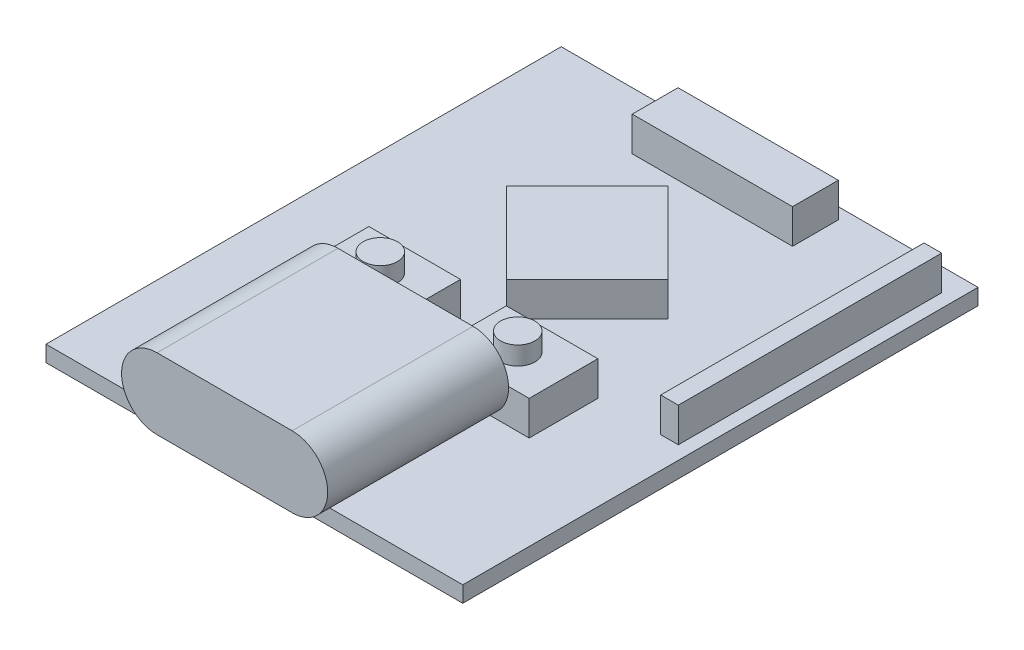
ISO-10303-21;
HEADER;
FILE_DESCRIPTION(('STEP AP214'),'2;1');
FILE_NAME('part.step','',(''),(''),'','','');
FILE_SCHEMA(('AUTOMOTIVE_DESIGN { 1 0 10303 214 1 1 1 1 }'));
ENDSEC;
DATA;
#1=APPLICATION_CONTEXT('core data for automotive mechanical design processes');
#2=APPLICATION_PROTOCOL_DEFINITION('international standard','automotive_design',2000,#1);
#3=PRODUCT_CONTEXT('',#1,'mechanical');
#4=PRODUCT('Part','Part','',(#3));
#5=PRODUCT_RELATED_PRODUCT_CATEGORY('part','',(#4));
#6=PRODUCT_DEFINITION_FORMATION('','',#4);
#7=PRODUCT_DEFINITION_CONTEXT('part definition',#1,'design');
#8=PRODUCT_DEFINITION('design','',#6,#7);
#9=PRODUCT_DEFINITION_SHAPE('','',#8);
#10=(LENGTH_UNIT() NAMED_UNIT(*) SI_UNIT(.MILLI.,.METRE.));
#11=(NAMED_UNIT(*) PLANE_ANGLE_UNIT() SI_UNIT($,.RADIAN.));
#12=(NAMED_UNIT(*) SI_UNIT($,.STERADIAN.) SOLID_ANGLE_UNIT());
#13=UNCERTAINTY_MEASURE_WITH_UNIT(LENGTH_MEASURE(1.E-05),#10,'distance_accuracy_value','');
#14=(GEOMETRIC_REPRESENTATION_CONTEXT(3) GLOBAL_UNCERTAINTY_ASSIGNED_CONTEXT((#13)) GLOBAL_UNIT_ASSIGNED_CONTEXT((#10,
#11,#12)) REPRESENTATION_CONTEXT('',''));
#15=CARTESIAN_POINT('',(0.,0.,0.));
#16=DIRECTION('',(0.,0.,1.));
#17=DIRECTION('',(1.,0.,0.));
#18=AXIS2_PLACEMENT_3D('',#15,#16,#17);
#19=CARTESIAN_POINT('',(-2.95,2.55,-6.6));
#20=DIRECTION('',(0.,0.,1.));
#21=DIRECTION('',(1.,0.,0.));
#22=AXIS2_PLACEMENT_3D('',#19,#20,#21);
#23=CYLINDRICAL_SURFACE('',#22,1.55);
#24=CARTESIAN_POINT('',(-2.95,2.55,1.3));
#25=DIRECTION('',(0.,0.,1.));
#26=DIRECTION('',(1.,0.,0.));
#27=AXIS2_PLACEMENT_3D('',#24,#25,#26);
#28=CIRCLE('',#27,1.55);
#29=CARTESIAN_POINT('',(-2.95,4.1,1.3));
#30=VERTEX_POINT('',#29);
#31=CARTESIAN_POINT('',(-2.95,1.,1.3));
#32=VERTEX_POINT('',#31);
#33=EDGE_CURVE('E123',#30,#32,#28,.T.);
#34=ORIENTED_EDGE('',*,*,#33,.F.);
#35=DIRECTION('',(0.,0.,1.));
#36=VECTOR('',#35,1.);
#37=CARTESIAN_POINT('',(-2.95,4.1,-6.6));
#38=LINE('',#37,#36);
#39=CARTESIAN_POINT('',(-2.95,4.1,-6.6));
#40=VERTEX_POINT('',#39);
#41=EDGE_CURVE('E14',#40,#30,#38,.T.);
#42=ORIENTED_EDGE('',*,*,#41,.F.);
#43=CARTESIAN_POINT('',(-2.95,2.55,-6.6));
#44=DIRECTION('',(0.,0.,1.));
#45=DIRECTION('',(1.,0.,0.));
#46=AXIS2_PLACEMENT_3D('',#43,#44,#45);
#47=CIRCLE('',#46,1.55);
#48=CARTESIAN_POINT('',(-2.95,1.,-6.6));
#49=VERTEX_POINT('',#48);
#50=EDGE_CURVE('E117',#40,#49,#47,.T.);
#51=ORIENTED_EDGE('',*,*,#50,.T.);
#52=DIRECTION('',(0.,0.,1.));
#53=VECTOR('',#52,1.);
#54=CARTESIAN_POINT('',(-2.95,1.,-6.6));
#55=LINE('',#54,#53);
#56=EDGE_CURVE('E62',#49,#32,#55,.T.);
#57=ORIENTED_EDGE('',*,*,#56,.T.);
#58=EDGE_LOOP('',(#34,#42,#51,#57));
#59=FACE_BOUND('',#58,.T.);
#60=ADVANCED_FACE('F59',(#59),#23,.T.);
#61=CARTESIAN_POINT('',(-2.95,4.1,-6.6));
#62=DIRECTION('',(0.,1.,0.));
#63=DIRECTION('',(-1.,0.,0.));
#64=AXIS2_PLACEMENT_3D('',#61,#62,#63);
#65=PLANE('',#64);
#66=DIRECTION('',(-1.,0.,0.));
#67=VECTOR('',#66,1.);
#68=CARTESIAN_POINT('',(-2.95,4.1,1.3));
#69=LINE('',#68,#67);
#70=CARTESIAN_POINT('',(2.95,4.1,1.3));
#71=VERTEX_POINT('',#70);
#72=EDGE_CURVE('E119',#71,#30,#69,.T.);
#73=ORIENTED_EDGE('',*,*,#72,.F.);
#74=DIRECTION('',(0.,0.,1.));
#75=VECTOR('',#74,1.);
#76=CARTESIAN_POINT('',(2.95,4.1,-6.6));
#77=LINE('',#76,#75);
#78=CARTESIAN_POINT('',(2.95,4.1,-6.6));
#79=VERTEX_POINT('',#78);
#80=EDGE_CURVE('E68',#79,#71,#77,.T.);
#81=ORIENTED_EDGE('',*,*,#80,.F.);
#82=DIRECTION('',(-1.,0.,0.));
#83=VECTOR('',#82,1.);
#84=CARTESIAN_POINT('',(-2.95,4.1,-6.6));
#85=LINE('',#84,#83);
#86=EDGE_CURVE('E114',#79,#40,#85,.T.);
#87=ORIENTED_EDGE('',*,*,#86,.T.);
#88=ORIENTED_EDGE('',*,*,#41,.T.);
#89=EDGE_LOOP('',(#73,#81,#87,#88));
#90=FACE_BOUND('',#89,.T.);
#91=ADVANCED_FACE('F133',(#90),#65,.T.);
#92=CARTESIAN_POINT('',(2.95,2.55,-6.6));
#93=DIRECTION('',(0.,0.,1.));
#94=DIRECTION('',(1.,0.,0.));
#95=AXIS2_PLACEMENT_3D('',#92,#93,#94);
#96=CYLINDRICAL_SURFACE('',#95,1.55);
#97=CARTESIAN_POINT('',(2.95,2.55,1.3));
#98=DIRECTION('',(0.,0.,1.));
#99=DIRECTION('',(1.,0.,0.));
#100=AXIS2_PLACEMENT_3D('',#97,#98,#99);
#101=CIRCLE('',#100,1.55);
#102=CARTESIAN_POINT('',(2.95,1.,1.3));
#103=VERTEX_POINT('',#102);
#104=EDGE_CURVE('E109',#103,#71,#101,.T.);
#105=ORIENTED_EDGE('',*,*,#104,.F.);
#106=DIRECTION('',(0.,0.,1.));
#107=VECTOR('',#106,1.);
#108=CARTESIAN_POINT('',(2.95,1.,-6.6));
#109=LINE('',#108,#107);
#110=CARTESIAN_POINT('',(2.95,1.,-6.6));
#111=VERTEX_POINT('',#110);
#112=EDGE_CURVE('E104',#111,#103,#109,.T.);
#113=ORIENTED_EDGE('',*,*,#112,.F.);
#114=CARTESIAN_POINT('',(2.95,2.55,-6.6));
#115=DIRECTION('',(0.,0.,1.));
#116=DIRECTION('',(1.,0.,0.));
#117=AXIS2_PLACEMENT_3D('',#114,#115,#116);
#118=CIRCLE('',#117,1.55);
#119=EDGE_CURVE('E107',#111,#79,#118,.T.);
#120=ORIENTED_EDGE('',*,*,#119,.T.);
#121=ORIENTED_EDGE('',*,*,#80,.T.);
#122=EDGE_LOOP('',(#105,#113,#120,#121));
#123=FACE_BOUND('',#122,.T.);
#124=ADVANCED_FACE('F106',(#123),#96,.T.);
#125=CARTESIAN_POINT('',(-2.95,1.,-6.6));
#126=DIRECTION('',(0.,-1.,0.));
#127=DIRECTION('',(1.,0.,0.));
#128=AXIS2_PLACEMENT_3D('',#125,#126,#127);
#129=PLANE('',#128);
#130=DIRECTION('',(1.,0.,0.));
#131=VECTOR('',#130,1.);
#132=CARTESIAN_POINT('',(-2.95,1.,1.3));
#133=LINE('',#132,#131);
#134=EDGE_CURVE('E126',#32,#103,#133,.T.);
#135=ORIENTED_EDGE('',*,*,#134,.F.);
#136=ORIENTED_EDGE('',*,*,#56,.F.);
#137=DIRECTION('',(1.,0.,0.));
#138=VECTOR('',#137,1.);
#139=CARTESIAN_POINT('',(-2.95,1.,-6.6));
#140=LINE('',#139,#138);
#141=EDGE_CURVE('E113',#49,#111,#140,.T.);
#142=ORIENTED_EDGE('',*,*,#141,.T.);
#143=ORIENTED_EDGE('',*,*,#112,.T.);
#144=EDGE_LOOP('',(#135,#136,#142,#143));
#145=FACE_BOUND('',#144,.T.);
#146=ADVANCED_FACE('F116',(#145),#129,.T.);
#147=CARTESIAN_POINT('',(-2.95,2.55,-6.6));
#148=DIRECTION('',(0.,0.,1.));
#149=DIRECTION('',(1.,0.,0.));
#150=AXIS2_PLACEMENT_3D('',#147,#148,#149);
#151=PLANE('',#150);
#152=ORIENTED_EDGE('',*,*,#50,.F.);
#153=ORIENTED_EDGE('',*,*,#86,.F.);
#154=ORIENTED_EDGE('',*,*,#119,.F.);
#155=ORIENTED_EDGE('',*,*,#141,.F.);
#156=EDGE_LOOP('',(#152,#153,#154,#155));
#157=FACE_BOUND('',#156,.T.);
#158=ADVANCED_FACE('F112',(#157),#151,.F.);
#159=CARTESIAN_POINT('',(-2.95,2.55,1.3));
#160=DIRECTION('',(0.,0.,1.));
#161=DIRECTION('',(1.,0.,0.));
#162=AXIS2_PLACEMENT_3D('',#159,#160,#161);
#163=PLANE('',#162);
#164=ORIENTED_EDGE('',*,*,#33,.T.);
#165=ORIENTED_EDGE('',*,*,#134,.T.);
#166=ORIENTED_EDGE('',*,*,#104,.T.);
#167=ORIENTED_EDGE('',*,*,#72,.T.);
#168=EDGE_LOOP('',(#164,#165,#166,#167));
#169=FACE_BOUND('',#168,.T.);
#170=ADVANCED_FACE('F132',(#169),#163,.T.);
#171=CLOSED_SHELL('',(#60,#91,#124,#146,#158,#170));
#172=MANIFOLD_SOLID_BREP('B2',#171);
#173=CARTESIAN_POINT('',(0.,0.7,0.));
#174=DIRECTION('',(0.,-1.,0.));
#175=DIRECTION('',(0.,0.,-1.));
#176=AXIS2_PLACEMENT_3D('',#173,#174,#175);
#177=PLANE('',#176);
#178=DIRECTION('',(-1.,0.,0.));
#179=VECTOR('',#178,1.);
#180=CARTESIAN_POINT('',(0.,0.7,-10.));
#181=LINE('',#180,#179);
#182=CARTESIAN_POINT('',(-0.999999999999998,0.7,-10.));
#183=VERTEX_POINT('',#182);
#184=CARTESIAN_POINT('',(-5.,0.7,-10.));
#185=VERTEX_POINT('',#184);
#186=EDGE_CURVE('E413',#183,#185,#181,.T.);
#187=ORIENTED_EDGE('',*,*,#186,.F.);
#188=DIRECTION('',(0.,0.,-1.));
#189=VECTOR('',#188,1.);
#190=CARTESIAN_POINT('',(-0.999999999999996,0.7,0.));
#191=LINE('',#190,#189);
#192=CARTESIAN_POINT('',(-0.999999999999997,0.7,-7.));
#193=VERTEX_POINT('',#192);
#194=EDGE_CURVE('E404',#193,#183,#191,.T.);
#195=ORIENTED_EDGE('',*,*,#194,.F.);
#196=DIRECTION('',(1.,0.,0.));
#197=VECTOR('',#196,1.);
#198=CARTESIAN_POINT('',(0.,0.7,-7.));
#199=LINE('',#198,#197);
#200=CARTESIAN_POINT('',(-5.,0.7,-7.));
#201=VERTEX_POINT('',#200);
#202=EDGE_CURVE('E407',#201,#193,#199,.T.);
#203=ORIENTED_EDGE('',*,*,#202,.F.);
#204=DIRECTION('',(0.,0.,1.));
#205=VECTOR('',#204,1.);
#206=CARTESIAN_POINT('',(-5.,0.7,0.));
#207=LINE('',#206,#205);
#208=EDGE_CURVE('E410',#185,#201,#207,.T.);
#209=ORIENTED_EDGE('',*,*,#208,.F.);
#210=EDGE_LOOP('',(#187,#195,#203,#209));
#211=FACE_BOUND('',#210,.T.);
#212=DIRECTION('',(0.,0.,1.));
#213=VECTOR('',#212,1.);
#214=CARTESIAN_POINT('',(1.,0.7,0.));
#215=LINE('',#214,#213);
#216=CARTESIAN_POINT('',(1.,0.7,-10.));
#217=VERTEX_POINT('',#216);
#218=CARTESIAN_POINT('',(1.,0.7,-7.));
#219=VERTEX_POINT('',#218);
#220=EDGE_CURVE('E479',#217,#219,#215,.T.);
#221=ORIENTED_EDGE('',*,*,#220,.F.);
#222=DIRECTION('',(-1.,0.,0.));
#223=VECTOR('',#222,1.);
#224=CARTESIAN_POINT('',(0.,0.7,-10.));
#225=LINE('',#224,#223);
#226=CARTESIAN_POINT('',(5.,0.7,-10.));
#227=VERTEX_POINT('',#226);
#228=EDGE_CURVE('E470',#227,#217,#225,.T.);
#229=ORIENTED_EDGE('',*,*,#228,.F.);
#230=DIRECTION('',(0.,0.,-1.));
#231=VECTOR('',#230,1.);
#232=CARTESIAN_POINT('',(5.,0.7,0.));
#233=LINE('',#232,#231);
#234=CARTESIAN_POINT('',(5.,0.7,-7.));
#235=VERTEX_POINT('',#234);
#236=EDGE_CURVE('E473',#235,#227,#233,.T.);
#237=ORIENTED_EDGE('',*,*,#236,.F.);
#238=DIRECTION('',(1.,0.,0.));
#239=VECTOR('',#238,1.);
#240=CARTESIAN_POINT('',(0.,0.7,-7.));
#241=LINE('',#240,#239);
#242=EDGE_CURVE('E476',#219,#235,#241,.T.);
#243=ORIENTED_EDGE('',*,*,#242,.F.);
#244=EDGE_LOOP('',(#221,#229,#237,#243));
#245=FACE_BOUND('',#244,.T.);
#246=DIRECTION('',(0.,0.,1.));
#247=VECTOR('',#246,1.);
#248=CARTESIAN_POINT('',(-9.1,0.7,0.));
#249=LINE('',#248,#247);
#250=CARTESIAN_POINT('',(-9.1,0.7,-22.5));
#251=VERTEX_POINT('',#250);
#252=CARTESIAN_POINT('',(-9.1,0.7,0.));
#253=VERTEX_POINT('',#252);
#254=EDGE_CURVE('E516',#251,#253,#249,.T.);
#255=ORIENTED_EDGE('',*,*,#254,.T.);
#256=DIRECTION('',(1.,0.,0.));
#257=VECTOR('',#256,1.);
#258=CARTESIAN_POINT('',(-9.1,0.7,0.));
#259=LINE('',#258,#257);
#260=CARTESIAN_POINT('',(9.1,0.7,0.));
#261=VERTEX_POINT('',#260);
#262=EDGE_CURVE('E519',#253,#261,#259,.T.);
#263=ORIENTED_EDGE('',*,*,#262,.T.);
#264=DIRECTION('',(0.,0.,-1.));
#265=VECTOR('',#264,1.);
#266=CARTESIAN_POINT('',(9.1,0.7,0.));
#267=LINE('',#266,#265);
#268=CARTESIAN_POINT('',(9.1,0.7,-22.5));
#269=VERTEX_POINT('',#268);
#270=EDGE_CURVE('E522',#261,#269,#267,.T.);
#271=ORIENTED_EDGE('',*,*,#270,.T.);
#272=DIRECTION('',(-1.,0.,0.));
#273=VECTOR('',#272,1.);
#274=CARTESIAN_POINT('',(-9.1,0.7,-22.5));
#275=LINE('',#274,#273);
#276=EDGE_CURVE('E524',#269,#251,#275,.T.);
#277=ORIENTED_EDGE('',*,*,#276,.T.);
#278=EDGE_LOOP('',(#255,#263,#271,#277));
#279=FACE_BOUND('',#278,.T.);
#280=DIRECTION('',(0.707106781186548,0.,0.707106781186547));
#281=VECTOR('',#280,1.);
#282=CARTESIAN_POINT('',(5.5,0.7,-5.50000000000001));
#283=LINE('',#282,#281);
#284=CARTESIAN_POINT('',(-3.53553390593274,0.7,-14.5355339059327));
#285=VERTEX_POINT('',#284);
#286=CARTESIAN_POINT('',(0.,0.7,-11.));
#287=VERTEX_POINT('',#286);
#288=EDGE_CURVE('E512',#285,#287,#283,.T.);
#289=ORIENTED_EDGE('',*,*,#288,.F.);
#290=DIRECTION('',(-0.707106781186548,0.,0.707106781186547));
#291=VECTOR('',#290,1.);
#292=CARTESIAN_POINT('',(-9.03553390593274,0.7,-9.03553390593274));
#293=LINE('',#292,#291);
#294=CARTESIAN_POINT('',(0.,0.7,-18.0710678118655));
#295=VERTEX_POINT('',#294);
#296=EDGE_CURVE('E503',#295,#285,#293,.T.);
#297=ORIENTED_EDGE('',*,*,#296,.F.);
#298=DIRECTION('',(-0.707106781186548,0.,-0.707106781186547));
#299=VECTOR('',#298,1.);
#300=CARTESIAN_POINT('',(9.03553390593274,0.7,-9.03553390593274));
#301=LINE('',#300,#299);
#302=CARTESIAN_POINT('',(3.53553390593274,0.7,-14.5355339059327));
#303=VERTEX_POINT('',#302);
#304=EDGE_CURVE('E506',#303,#295,#301,.T.);
#305=ORIENTED_EDGE('',*,*,#304,.F.);
#306=DIRECTION('',(0.707106781186547,0.,-0.707106781186548));
#307=VECTOR('',#306,1.);
#308=CARTESIAN_POINT('',(-5.5,0.7,-5.5));
#309=LINE('',#308,#307);
#310=EDGE_CURVE('E509',#287,#303,#309,.T.);
#311=ORIENTED_EDGE('',*,*,#310,.F.);
#312=EDGE_LOOP('',(#289,#297,#305,#311));
#313=FACE_BOUND('',#312,.T.);
#314=DIRECTION('',(0.,0.,1.));
#315=VECTOR('',#314,1.);
#316=CARTESIAN_POINT('',(-3.5,0.7,0.));
#317=LINE('',#316,#315);
#318=CARTESIAN_POINT('',(-3.5,0.7,-22.));
#319=VERTEX_POINT('',#318);
#320=CARTESIAN_POINT('',(-3.5,0.7,-20.));
#321=VERTEX_POINT('',#320);
#322=EDGE_CURVE('E446',#319,#321,#317,.T.);
#323=ORIENTED_EDGE('',*,*,#322,.F.);
#324=DIRECTION('',(-1.,0.,0.));
#325=VECTOR('',#324,1.);
#326=CARTESIAN_POINT('',(0.,0.7,-22.));
#327=LINE('',#326,#325);
#328=CARTESIAN_POINT('',(3.5,0.7,-22.));
#329=VERTEX_POINT('',#328);
#330=EDGE_CURVE('E437',#329,#319,#327,.T.);
#331=ORIENTED_EDGE('',*,*,#330,.F.);
#332=DIRECTION('',(0.,0.,-1.));
#333=VECTOR('',#332,1.);
#334=CARTESIAN_POINT('',(3.49999999999999,0.7,0.));
#335=LINE('',#334,#333);
#336=CARTESIAN_POINT('',(3.5,0.7,-20.));
#337=VERTEX_POINT('',#336);
#338=EDGE_CURVE('E440',#337,#329,#335,.T.);
#339=ORIENTED_EDGE('',*,*,#338,.F.);
#340=DIRECTION('',(1.,0.,0.));
#341=VECTOR('',#340,1.);
#342=CARTESIAN_POINT('',(0.,0.7,-20.));
#343=LINE('',#342,#341);
#344=EDGE_CURVE('E443',#321,#337,#343,.T.);
#345=ORIENTED_EDGE('',*,*,#344,.F.);
#346=EDGE_LOOP('',(#323,#331,#339,#345));
#347=FACE_BOUND('',#346,.T.);
#348=DIRECTION('',(0.,0.,1.));
#349=VECTOR('',#348,1.);
#350=CARTESIAN_POINT('',(7.7437978616926,0.7,0.));
#351=LINE('',#350,#349);
#352=CARTESIAN_POINT('',(7.7437978616926,0.7,-21.5));
#353=VERTEX_POINT('',#352);
#354=CARTESIAN_POINT('',(7.7437978616926,0.7,-10.));
#355=VERTEX_POINT('',#354);
#356=EDGE_CURVE('E371',#353,#355,#351,.T.);
#357=ORIENTED_EDGE('',*,*,#356,.F.);
#358=DIRECTION('',(-1.,0.,0.));
#359=VECTOR('',#358,1.);
#360=CARTESIAN_POINT('',(0.,0.7,-21.5));
#361=LINE('',#360,#359);
#362=CARTESIAN_POINT('',(8.51186104562512,0.7,-21.5));
#363=VERTEX_POINT('',#362);
#364=EDGE_CURVE('E372',#363,#353,#361,.T.);
#365=ORIENTED_EDGE('',*,*,#364,.F.);
#366=DIRECTION('',(0.,0.,-1.));
#367=VECTOR('',#366,1.);
#368=CARTESIAN_POINT('',(8.51186104562511,0.7,0.));
#369=LINE('',#368,#367);
#370=CARTESIAN_POINT('',(8.51186104562511,0.7,-10.));
#371=VERTEX_POINT('',#370);
#372=EDGE_CURVE('E210',#371,#363,#369,.T.);
#373=ORIENTED_EDGE('',*,*,#372,.F.);
#374=DIRECTION('',(1.,0.,0.));
#375=VECTOR('',#374,1.);
#376=CARTESIAN_POINT('',(0.,0.7,-10.));
#377=LINE('',#376,#375);
#378=EDGE_CURVE('E205',#355,#371,#377,.T.);
#379=ORIENTED_EDGE('',*,*,#378,.F.);
#380=EDGE_LOOP('',(#357,#365,#373,#379));
#381=FACE_BOUND('',#380,.T.);
#382=ADVANCED_FACE('F188',(#211,#245,#279,#313,#347,#381),#177,.F.);
#383=CARTESIAN_POINT('',(-9.1,0.7,0.));
#384=DIRECTION('',(1.,0.,0.));
#385=DIRECTION('',(0.,0.,-1.));
#386=AXIS2_PLACEMENT_3D('',#383,#384,#385);
#387=PLANE('',#386);
#388=DIRECTION('',(0.,0.,1.));
#389=VECTOR('',#388,1.);
#390=CARTESIAN_POINT('',(-9.1,0.,0.));
#391=LINE('',#390,#389);
#392=CARTESIAN_POINT('',(-9.1,0.,-22.5));
#393=VERTEX_POINT('',#392);
#394=CARTESIAN_POINT('',(-9.1,0.,0.));
#395=VERTEX_POINT('',#394);
#396=EDGE_CURVE('E515',#393,#395,#391,.T.);
#397=ORIENTED_EDGE('',*,*,#396,.T.);
#398=DIRECTION('',(0.,-1.,0.));
#399=VECTOR('',#398,1.);
#400=CARTESIAN_POINT('',(-9.1,0.7,0.));
#401=LINE('',#400,#399);
#402=EDGE_CURVE('E57',#253,#395,#401,.T.);
#403=ORIENTED_EDGE('',*,*,#402,.F.);
#404=ORIENTED_EDGE('',*,*,#254,.F.);
#405=DIRECTION('',(0.,-1.,0.));
#406=VECTOR('',#405,1.);
#407=CARTESIAN_POINT('',(-9.1,0.7,-22.5));
#408=LINE('',#407,#406);
#409=EDGE_CURVE('E526',#251,#393,#408,.T.);
#410=ORIENTED_EDGE('',*,*,#409,.T.);
#411=EDGE_LOOP('',(#397,#403,#404,#410));
#412=FACE_BOUND('',#411,.T.);
#413=ADVANCED_FACE('F190',(#412),#387,.F.);
#414=CARTESIAN_POINT('',(-9.1,0.7,0.));
#415=DIRECTION('',(0.,0.,-1.));
#416=DIRECTION('',(-1.,0.,0.));
#417=AXIS2_PLACEMENT_3D('',#414,#415,#416);
#418=PLANE('',#417);
#419=DIRECTION('',(1.,0.,0.));
#420=VECTOR('',#419,1.);
#421=CARTESIAN_POINT('',(-9.1,0.,0.));
#422=LINE('',#421,#420);
#423=CARTESIAN_POINT('',(9.1,0.,0.));
#424=VERTEX_POINT('',#423);
#425=EDGE_CURVE('E529',#395,#424,#422,.T.);
#426=ORIENTED_EDGE('',*,*,#425,.T.);
#427=DIRECTION('',(0.,-1.,0.));
#428=VECTOR('',#427,1.);
#429=CARTESIAN_POINT('',(9.1,0.7,0.));
#430=LINE('',#429,#428);
#431=EDGE_CURVE('E197',#261,#424,#430,.T.);
#432=ORIENTED_EDGE('',*,*,#431,.F.);
#433=ORIENTED_EDGE('',*,*,#262,.F.);
#434=ORIENTED_EDGE('',*,*,#402,.T.);
#435=EDGE_LOOP('',(#426,#432,#433,#434));
#436=FACE_BOUND('',#435,.T.);
#437=ADVANCED_FACE('F575',(#436),#418,.F.);
#438=CARTESIAN_POINT('',(9.1,0.7,0.));
#439=DIRECTION('',(-1.,0.,0.));
#440=DIRECTION('',(0.,0.,1.));
#441=AXIS2_PLACEMENT_3D('',#438,#439,#440);
#442=PLANE('',#441);
#443=DIRECTION('',(0.,0.,-1.));
#444=VECTOR('',#443,1.);
#445=CARTESIAN_POINT('',(9.1,0.,0.));
#446=LINE('',#445,#444);
#447=CARTESIAN_POINT('',(9.1,0.,-22.5));
#448=VERTEX_POINT('',#447);
#449=EDGE_CURVE('E531',#424,#448,#446,.T.);
#450=ORIENTED_EDGE('',*,*,#449,.T.);
#451=DIRECTION('',(0.,-1.,0.));
#452=VECTOR('',#451,1.);
#453=CARTESIAN_POINT('',(9.1,0.7,-22.5));
#454=LINE('',#453,#452);
#455=EDGE_CURVE('E536',#269,#448,#454,.T.);
#456=ORIENTED_EDGE('',*,*,#455,.F.);
#457=ORIENTED_EDGE('',*,*,#270,.F.);
#458=ORIENTED_EDGE('',*,*,#431,.T.);
#459=EDGE_LOOP('',(#450,#456,#457,#458));
#460=FACE_BOUND('',#459,.T.);
#461=ADVANCED_FACE('F589',(#460),#442,.F.);
#462=CARTESIAN_POINT('',(-9.1,0.7,-22.5));
#463=DIRECTION('',(0.,0.,1.));
#464=DIRECTION('',(1.,0.,0.));
#465=AXIS2_PLACEMENT_3D('',#462,#463,#464);
#466=PLANE('',#465);
#467=DIRECTION('',(-1.,0.,0.));
#468=VECTOR('',#467,1.);
#469=CARTESIAN_POINT('',(-9.1,0.,-22.5));
#470=LINE('',#469,#468);
#471=EDGE_CURVE('E520',#448,#393,#470,.T.);
#472=ORIENTED_EDGE('',*,*,#471,.T.);
#473=ORIENTED_EDGE('',*,*,#409,.F.);
#474=ORIENTED_EDGE('',*,*,#276,.F.);
#475=ORIENTED_EDGE('',*,*,#455,.T.);
#476=EDGE_LOOP('',(#472,#473,#474,#475));
#477=FACE_BOUND('',#476,.T.);
#478=ADVANCED_FACE('F585',(#477),#466,.F.);
#479=CARTESIAN_POINT('',(0.,0.,0.));
#480=DIRECTION('',(0.,-1.,0.));
#481=DIRECTION('',(0.,0.,-1.));
#482=AXIS2_PLACEMENT_3D('',#479,#480,#481);
#483=PLANE('',#482);
#484=ORIENTED_EDGE('',*,*,#396,.F.);
#485=ORIENTED_EDGE('',*,*,#471,.F.);
#486=ORIENTED_EDGE('',*,*,#449,.F.);
#487=ORIENTED_EDGE('',*,*,#425,.F.);
#488=EDGE_LOOP('',(#484,#485,#486,#487));
#489=FACE_BOUND('',#488,.T.);
#490=ADVANCED_FACE('F582',(#489),#483,.T.);
#491=CARTESIAN_POINT('',(-3.53553390593274,2.2,-14.5355339059327));
#492=DIRECTION('',(0.707106781186547,0.,-0.707106781186548));
#493=DIRECTION('',(-0.707106781186548,0.,-0.707106781186547));
#494=AXIS2_PLACEMENT_3D('',#491,#492,#493);
#495=PLANE('',#494);
#496=DIRECTION('',(0.,-1.,0.));
#497=VECTOR('',#496,1.);
#498=CARTESIAN_POINT('',(-3.53553390593274,2.2,-14.5355339059327));
#499=LINE('',#498,#497);
#500=CARTESIAN_POINT('',(-3.53553390593274,2.2,-14.5355339059327));
#501=VERTEX_POINT('',#500);
#502=EDGE_CURVE('E491',#501,#285,#499,.T.);
#503=ORIENTED_EDGE('',*,*,#502,.T.);
#504=ORIENTED_EDGE('',*,*,#288,.T.);
#505=DIRECTION('',(0.,-1.,0.));
#506=VECTOR('',#505,1.);
#507=CARTESIAN_POINT('',(0.,2.2,-11.));
#508=LINE('',#507,#506);
#509=CARTESIAN_POINT('',(0.,2.2,-11.));
#510=VERTEX_POINT('',#509);
#511=EDGE_CURVE('E500',#510,#287,#508,.T.);
#512=ORIENTED_EDGE('',*,*,#511,.F.);
#513=DIRECTION('',(0.707106781186548,0.,0.707106781186547));
#514=VECTOR('',#513,1.);
#515=CARTESIAN_POINT('',(-3.53553390593274,2.2,-14.5355339059327));
#516=LINE('',#515,#514);
#517=EDGE_CURVE('E482',#501,#510,#516,.T.);
#518=ORIENTED_EDGE('',*,*,#517,.F.);
#519=EDGE_LOOP('',(#503,#504,#512,#518));
#520=FACE_BOUND('',#519,.T.);
#521=ADVANCED_FACE('F580',(#520),#495,.F.);
#522=CARTESIAN_POINT('',(0.,2.2,-11.));
#523=DIRECTION('',(-0.707106781186548,0.,-0.707106781186547));
#524=DIRECTION('',(-0.707106781186547,0.,0.707106781186548));
#525=AXIS2_PLACEMENT_3D('',#522,#523,#524);
#526=PLANE('',#525);
#527=ORIENTED_EDGE('',*,*,#511,.T.);
#528=ORIENTED_EDGE('',*,*,#310,.T.);
#529=DIRECTION('',(0.,-1.,0.));
#530=VECTOR('',#529,1.);
#531=CARTESIAN_POINT('',(3.53553390593274,2.2,-14.5355339059327));
#532=LINE('',#531,#530);
#533=CARTESIAN_POINT('',(3.53553390593274,2.2,-14.5355339059327));
#534=VERTEX_POINT('',#533);
#535=EDGE_CURVE('E497',#534,#303,#532,.T.);
#536=ORIENTED_EDGE('',*,*,#535,.F.);
#537=DIRECTION('',(0.707106781186547,0.,-0.707106781186548));
#538=VECTOR('',#537,1.);
#539=CARTESIAN_POINT('',(0.,2.2,-11.));
#540=LINE('',#539,#538);
#541=EDGE_CURVE('E485',#510,#534,#540,.T.);
#542=ORIENTED_EDGE('',*,*,#541,.F.);
#543=EDGE_LOOP('',(#527,#528,#536,#542));
#544=FACE_BOUND('',#543,.T.);
#545=ADVANCED_FACE('F666',(#544),#526,.F.);
#546=CARTESIAN_POINT('',(0.,2.2,-18.0710678118655));
#547=DIRECTION('',(-0.707106781186547,0.,0.707106781186548));
#548=DIRECTION('',(0.707106781186548,0.,0.707106781186547));
#549=AXIS2_PLACEMENT_3D('',#546,#547,#548);
#550=PLANE('',#549);
#551=ORIENTED_EDGE('',*,*,#535,.T.);
#552=ORIENTED_EDGE('',*,*,#304,.T.);
#553=DIRECTION('',(0.,-1.,0.));
#554=VECTOR('',#553,1.);
#555=CARTESIAN_POINT('',(0.,2.2,-18.0710678118655));
#556=LINE('',#555,#554);
#557=CARTESIAN_POINT('',(0.,2.2,-18.0710678118655));
#558=VERTEX_POINT('',#557);
#559=EDGE_CURVE('E494',#558,#295,#556,.T.);
#560=ORIENTED_EDGE('',*,*,#559,.F.);
#561=DIRECTION('',(-0.707106781186548,0.,-0.707106781186547));
#562=VECTOR('',#561,1.);
#563=CARTESIAN_POINT('',(0.,2.2,-18.0710678118655));
#564=LINE('',#563,#562);
#565=EDGE_CURVE('E487',#534,#558,#564,.T.);
#566=ORIENTED_EDGE('',*,*,#565,.F.);
#567=EDGE_LOOP('',(#551,#552,#560,#566));
#568=FACE_BOUND('',#567,.T.);
#569=ADVANCED_FACE('F663',(#568),#550,.F.);
#570=CARTESIAN_POINT('',(-3.53553390593274,2.2,-14.5355339059327));
#571=DIRECTION('',(0.707106781186547,0.,0.707106781186548));
#572=DIRECTION('',(0.707106781186548,0.,-0.707106781186547));
#573=AXIS2_PLACEMENT_3D('',#570,#571,#572);
#574=PLANE('',#573);
#575=ORIENTED_EDGE('',*,*,#559,.T.);
#576=ORIENTED_EDGE('',*,*,#296,.T.);
#577=ORIENTED_EDGE('',*,*,#502,.F.);
#578=DIRECTION('',(-0.707106781186548,0.,0.707106781186547));
#579=VECTOR('',#578,1.);
#580=CARTESIAN_POINT('',(-3.53553390593274,2.2,-14.5355339059327));
#581=LINE('',#580,#579);
#582=EDGE_CURVE('E489',#558,#501,#581,.T.);
#583=ORIENTED_EDGE('',*,*,#582,.F.);
#584=EDGE_LOOP('',(#575,#576,#577,#583));
#585=FACE_BOUND('',#584,.T.);
#586=ADVANCED_FACE('F659',(#585),#574,.F.);
#587=CARTESIAN_POINT('',(0.,2.2,0.));
#588=DIRECTION('',(0.,1.,0.));
#589=DIRECTION('',(0.,0.,1.));
#590=AXIS2_PLACEMENT_3D('',#587,#588,#589);
#591=PLANE('',#590);
#592=ORIENTED_EDGE('',*,*,#517,.T.);
#593=ORIENTED_EDGE('',*,*,#541,.T.);
#594=ORIENTED_EDGE('',*,*,#565,.T.);
#595=ORIENTED_EDGE('',*,*,#582,.T.);
#596=EDGE_LOOP('',(#592,#593,#594,#595));
#597=FACE_BOUND('',#596,.T.);
#598=ADVANCED_FACE('F655',(#597),#591,.T.);
#599=CARTESIAN_POINT('',(1.,2.2,-10.));
#600=DIRECTION('',(1.,0.,0.));
#601=DIRECTION('',(0.,0.,-1.));
#602=AXIS2_PLACEMENT_3D('',#599,#600,#601);
#603=PLANE('',#602);
#604=DIRECTION('',(0.,-1.,0.));
#605=VECTOR('',#604,1.);
#606=CARTESIAN_POINT('',(1.,2.2,-10.));
#607=LINE('',#606,#605);
#608=CARTESIAN_POINT('',(1.,2.2,-10.));
#609=VERTEX_POINT('',#608);
#610=EDGE_CURVE('E458',#609,#217,#607,.T.);
#611=ORIENTED_EDGE('',*,*,#610,.T.);
#612=ORIENTED_EDGE('',*,*,#220,.T.);
#613=DIRECTION('',(0.,-1.,0.));
#614=VECTOR('',#613,1.);
#615=CARTESIAN_POINT('',(1.,2.2,-7.));
#616=LINE('',#615,#614);
#617=CARTESIAN_POINT('',(1.,2.2,-7.));
#618=VERTEX_POINT('',#617);
#619=EDGE_CURVE('E467',#618,#219,#616,.T.);
#620=ORIENTED_EDGE('',*,*,#619,.F.);
#621=DIRECTION('',(0.,0.,1.));
#622=VECTOR('',#621,1.);
#623=CARTESIAN_POINT('',(1.,2.2,-10.));
#624=LINE('',#623,#622);
#625=EDGE_CURVE('E449',#609,#618,#624,.T.);
#626=ORIENTED_EDGE('',*,*,#625,.F.);
#627=EDGE_LOOP('',(#611,#612,#620,#626));
#628=FACE_BOUND('',#627,.T.);
#629=ADVANCED_FACE('F651',(#628),#603,.F.);
#630=CARTESIAN_POINT('',(1.,2.2,-7.));
#631=DIRECTION('',(0.,0.,-1.));
#632=DIRECTION('',(-1.,0.,0.));
#633=AXIS2_PLACEMENT_3D('',#630,#631,#632);
#634=PLANE('',#633);
#635=ORIENTED_EDGE('',*,*,#619,.T.);
#636=ORIENTED_EDGE('',*,*,#242,.T.);
#637=DIRECTION('',(0.,-1.,0.));
#638=VECTOR('',#637,1.);
#639=CARTESIAN_POINT('',(5.,2.2,-7.));
#640=LINE('',#639,#638);
#641=CARTESIAN_POINT('',(5.,2.2,-7.));
#642=VERTEX_POINT('',#641);
#643=EDGE_CURVE('E464',#642,#235,#640,.T.);
#644=ORIENTED_EDGE('',*,*,#643,.F.);
#645=DIRECTION('',(1.,0.,0.));
#646=VECTOR('',#645,1.);
#647=CARTESIAN_POINT('',(1.,2.2,-7.));
#648=LINE('',#647,#646);
#649=EDGE_CURVE('E452',#618,#642,#648,.T.);
#650=ORIENTED_EDGE('',*,*,#649,.F.);
#651=EDGE_LOOP('',(#635,#636,#644,#650));
#652=FACE_BOUND('',#651,.T.);
#653=ADVANCED_FACE('F647',(#652),#634,.F.);
#654=CARTESIAN_POINT('',(5.,2.2,-10.));
#655=DIRECTION('',(-1.,0.,0.));
#656=DIRECTION('',(0.,0.,1.));
#657=AXIS2_PLACEMENT_3D('',#654,#655,#656);
#658=PLANE('',#657);
#659=ORIENTED_EDGE('',*,*,#643,.T.);
#660=ORIENTED_EDGE('',*,*,#236,.T.);
#661=DIRECTION('',(0.,-1.,0.));
#662=VECTOR('',#661,1.);
#663=CARTESIAN_POINT('',(5.,2.2,-10.));
#664=LINE('',#663,#662);
#665=CARTESIAN_POINT('',(5.,2.2,-10.));
#666=VERTEX_POINT('',#665);
#667=EDGE_CURVE('E461',#666,#227,#664,.T.);
#668=ORIENTED_EDGE('',*,*,#667,.F.);
#669=DIRECTION('',(0.,0.,-1.));
#670=VECTOR('',#669,1.);
#671=CARTESIAN_POINT('',(5.,2.2,-10.));
#672=LINE('',#671,#670);
#673=EDGE_CURVE('E454',#642,#666,#672,.T.);
#674=ORIENTED_EDGE('',*,*,#673,.F.);
#675=EDGE_LOOP('',(#659,#660,#668,#674));
#676=FACE_BOUND('',#675,.T.);
#677=ADVANCED_FACE('F643',(#676),#658,.F.);
#678=CARTESIAN_POINT('',(1.,2.2,-10.));
#679=DIRECTION('',(0.,0.,1.));
#680=DIRECTION('',(1.,0.,0.));
#681=AXIS2_PLACEMENT_3D('',#678,#679,#680);
#682=PLANE('',#681);
#683=ORIENTED_EDGE('',*,*,#667,.T.);
#684=ORIENTED_EDGE('',*,*,#228,.T.);
#685=ORIENTED_EDGE('',*,*,#610,.F.);
#686=DIRECTION('',(-1.,0.,0.));
#687=VECTOR('',#686,1.);
#688=CARTESIAN_POINT('',(1.,2.2,-10.));
#689=LINE('',#688,#687);
#690=EDGE_CURVE('E456',#666,#609,#689,.T.);
#691=ORIENTED_EDGE('',*,*,#690,.F.);
#692=EDGE_LOOP('',(#683,#684,#685,#691));
#693=FACE_BOUND('',#692,.T.);
#694=ADVANCED_FACE('F640',(#693),#682,.F.);
#695=CARTESIAN_POINT('',(0.,2.2,0.));
#696=DIRECTION('',(0.,1.,0.));
#697=DIRECTION('',(0.,0.,1.));
#698=AXIS2_PLACEMENT_3D('',#695,#696,#697);
#699=PLANE('',#698);
#700=CARTESIAN_POINT('',(3.,2.2,-8.5));
#701=DIRECTION('',(0.,1.,0.));
#702=DIRECTION('',(0.,0.,1.));
#703=AXIS2_PLACEMENT_3D('',#700,#701,#702);
#704=CIRCLE('',#703,0.75);
#705=CARTESIAN_POINT('',(3.,2.2,-7.75));
#706=VERTEX_POINT('',#705);
#707=EDGE_CURVE('E368',#706,#706,#704,.F.);
#708=ORIENTED_EDGE('',*,*,#707,.T.);
#709=EDGE_LOOP('',(#708));
#710=FACE_BOUND('',#709,.T.);
#711=ORIENTED_EDGE('',*,*,#625,.T.);
#712=ORIENTED_EDGE('',*,*,#649,.T.);
#713=ORIENTED_EDGE('',*,*,#673,.T.);
#714=ORIENTED_EDGE('',*,*,#690,.T.);
#715=EDGE_LOOP('',(#711,#712,#713,#714));
#716=FACE_BOUND('',#715,.T.);
#717=ADVANCED_FACE('F634',(#710,#716),#699,.T.);
#718=CARTESIAN_POINT('',(-3.5,2.2,-22.));
#719=DIRECTION('',(1.,0.,0.));
#720=DIRECTION('',(0.,0.,-1.));
#721=AXIS2_PLACEMENT_3D('',#718,#719,#720);
#722=PLANE('',#721);
#723=DIRECTION('',(0.,-1.,0.));
#724=VECTOR('',#723,1.);
#725=CARTESIAN_POINT('',(-3.5,2.2,-22.));
#726=LINE('',#725,#724);
#727=CARTESIAN_POINT('',(-3.5,2.2,-22.));
#728=VERTEX_POINT('',#727);
#729=EDGE_CURVE('E425',#728,#319,#726,.T.);
#730=ORIENTED_EDGE('',*,*,#729,.T.);
#731=ORIENTED_EDGE('',*,*,#322,.T.);
#732=DIRECTION('',(0.,-1.,0.));
#733=VECTOR('',#732,1.);
#734=CARTESIAN_POINT('',(-3.5,2.2,-20.));
#735=LINE('',#734,#733);
#736=CARTESIAN_POINT('',(-3.5,2.2,-20.));
#737=VERTEX_POINT('',#736);
#738=EDGE_CURVE('E434',#737,#321,#735,.T.);
#739=ORIENTED_EDGE('',*,*,#738,.F.);
#740=DIRECTION('',(0.,0.,1.));
#741=VECTOR('',#740,1.);
#742=CARTESIAN_POINT('',(-3.5,2.2,-22.));
#743=LINE('',#742,#741);
#744=EDGE_CURVE('E416',#728,#737,#743,.T.);
#745=ORIENTED_EDGE('',*,*,#744,.F.);
#746=EDGE_LOOP('',(#730,#731,#739,#745));
#747=FACE_BOUND('',#746,.T.);
#748=ADVANCED_FACE('F618',(#747),#722,.F.);
#749=CARTESIAN_POINT('',(-3.5,2.2,-20.));
#750=DIRECTION('',(0.,0.,-1.));
#751=DIRECTION('',(-1.,0.,0.));
#752=AXIS2_PLACEMENT_3D('',#749,#750,#751);
#753=PLANE('',#752);
#754=ORIENTED_EDGE('',*,*,#738,.T.);
#755=ORIENTED_EDGE('',*,*,#344,.T.);
#756=DIRECTION('',(0.,-1.,0.));
#757=VECTOR('',#756,1.);
#758=CARTESIAN_POINT('',(3.5,2.2,-20.));
#759=LINE('',#758,#757);
#760=CARTESIAN_POINT('',(3.5,2.2,-20.));
#761=VERTEX_POINT('',#760);
#762=EDGE_CURVE('E431',#761,#337,#759,.T.);
#763=ORIENTED_EDGE('',*,*,#762,.F.);
#764=DIRECTION('',(1.,0.,0.));
#765=VECTOR('',#764,1.);
#766=CARTESIAN_POINT('',(-3.5,2.2,-20.));
#767=LINE('',#766,#765);
#768=EDGE_CURVE('E419',#737,#761,#767,.T.);
#769=ORIENTED_EDGE('',*,*,#768,.F.);
#770=EDGE_LOOP('',(#754,#755,#763,#769));
#771=FACE_BOUND('',#770,.T.);
#772=ADVANCED_FACE('F626',(#771),#753,.F.);
#773=CARTESIAN_POINT('',(3.5,2.2,-22.));
#774=DIRECTION('',(-1.,0.,0.));
#775=DIRECTION('',(0.,0.,1.));
#776=AXIS2_PLACEMENT_3D('',#773,#774,#775);
#777=PLANE('',#776);
#778=ORIENTED_EDGE('',*,*,#762,.T.);
#779=ORIENTED_EDGE('',*,*,#338,.T.);
#780=DIRECTION('',(0.,-1.,0.));
#781=VECTOR('',#780,1.);
#782=CARTESIAN_POINT('',(3.5,2.2,-22.));
#783=LINE('',#782,#781);
#784=CARTESIAN_POINT('',(3.5,2.2,-22.));
#785=VERTEX_POINT('',#784);
#786=EDGE_CURVE('E428',#785,#329,#783,.T.);
#787=ORIENTED_EDGE('',*,*,#786,.F.);
#788=DIRECTION('',(0.,0.,-1.));
#789=VECTOR('',#788,1.);
#790=CARTESIAN_POINT('',(3.5,2.2,-22.));
#791=LINE('',#790,#789);
#792=EDGE_CURVE('E421',#761,#785,#791,.T.);
#793=ORIENTED_EDGE('',*,*,#792,.F.);
#794=EDGE_LOOP('',(#778,#779,#787,#793));
#795=FACE_BOUND('',#794,.T.);
#796=ADVANCED_FACE('F624',(#795),#777,.F.);
#797=CARTESIAN_POINT('',(-3.5,2.2,-22.));
#798=DIRECTION('',(0.,0.,1.));
#799=DIRECTION('',(1.,0.,0.));
#800=AXIS2_PLACEMENT_3D('',#797,#798,#799);
#801=PLANE('',#800);
#802=ORIENTED_EDGE('',*,*,#786,.T.);
#803=ORIENTED_EDGE('',*,*,#330,.T.);
#804=ORIENTED_EDGE('',*,*,#729,.F.);
#805=DIRECTION('',(-1.,0.,0.));
#806=VECTOR('',#805,1.);
#807=CARTESIAN_POINT('',(-3.5,2.2,-22.));
#808=LINE('',#807,#806);
#809=EDGE_CURVE('E423',#785,#728,#808,.T.);
#810=ORIENTED_EDGE('',*,*,#809,.F.);
#811=EDGE_LOOP('',(#802,#803,#804,#810));
#812=FACE_BOUND('',#811,.T.);
#813=ADVANCED_FACE('F614',(#812),#801,.F.);
#814=CARTESIAN_POINT('',(0.,2.2,0.));
#815=DIRECTION('',(0.,1.,0.));
#816=DIRECTION('',(0.,0.,1.));
#817=AXIS2_PLACEMENT_3D('',#814,#815,#816);
#818=PLANE('',#817);
#819=ORIENTED_EDGE('',*,*,#744,.T.);
#820=ORIENTED_EDGE('',*,*,#768,.T.);
#821=ORIENTED_EDGE('',*,*,#792,.T.);
#822=ORIENTED_EDGE('',*,*,#809,.T.);
#823=EDGE_LOOP('',(#819,#820,#821,#822));
#824=FACE_BOUND('',#823,.T.);
#825=ADVANCED_FACE('F620',(#824),#818,.T.);
#826=CARTESIAN_POINT('',(-0.999999999999998,2.2,-10.));
#827=DIRECTION('',(0.,0.,1.));
#828=DIRECTION('',(1.,0.,0.));
#829=AXIS2_PLACEMENT_3D('',#826,#827,#828);
#830=PLANE('',#829);
#831=DIRECTION('',(0.,-1.,0.));
#832=VECTOR('',#831,1.);
#833=CARTESIAN_POINT('',(-0.999999999999998,2.2,-10.));
#834=LINE('',#833,#832);
#835=CARTESIAN_POINT('',(-0.999999999999998,2.2,-10.));
#836=VERTEX_POINT('',#835);
#837=EDGE_CURVE('E392',#836,#183,#834,.T.);
#838=ORIENTED_EDGE('',*,*,#837,.T.);
#839=ORIENTED_EDGE('',*,*,#186,.T.);
#840=DIRECTION('',(0.,-1.,0.));
#841=VECTOR('',#840,1.);
#842=CARTESIAN_POINT('',(-5.,2.2,-10.));
#843=LINE('',#842,#841);
#844=CARTESIAN_POINT('',(-5.,2.2,-10.));
#845=VERTEX_POINT('',#844);
#846=EDGE_CURVE('E401',#845,#185,#843,.T.);
#847=ORIENTED_EDGE('',*,*,#846,.F.);
#848=DIRECTION('',(-1.,0.,0.));
#849=VECTOR('',#848,1.);
#850=CARTESIAN_POINT('',(-0.999999999999998,2.2,-10.));
#851=LINE('',#850,#849);
#852=EDGE_CURVE('E383',#836,#845,#851,.T.);
#853=ORIENTED_EDGE('',*,*,#852,.F.);
#854=EDGE_LOOP('',(#838,#839,#847,#853));
#855=FACE_BOUND('',#854,.T.);
#856=ADVANCED_FACE('F791',(#855),#830,.F.);
#857=CARTESIAN_POINT('',(-5.,2.2,-10.));
#858=DIRECTION('',(1.,0.,0.));
#859=DIRECTION('',(0.,0.,-1.));
#860=AXIS2_PLACEMENT_3D('',#857,#858,#859);
#861=PLANE('',#860);
#862=ORIENTED_EDGE('',*,*,#846,.T.);
#863=ORIENTED_EDGE('',*,*,#208,.T.);
#864=DIRECTION('',(0.,-1.,0.));
#865=VECTOR('',#864,1.);
#866=CARTESIAN_POINT('',(-5.,2.2,-7.));
#867=LINE('',#866,#865);
#868=CARTESIAN_POINT('',(-5.,2.2,-7.));
#869=VERTEX_POINT('',#868);
#870=EDGE_CURVE('E398',#869,#201,#867,.T.);
#871=ORIENTED_EDGE('',*,*,#870,.F.);
#872=DIRECTION('',(0.,0.,1.));
#873=VECTOR('',#872,1.);
#874=CARTESIAN_POINT('',(-5.,2.2,-10.));
#875=LINE('',#874,#873);
#876=EDGE_CURVE('E386',#845,#869,#875,.T.);
#877=ORIENTED_EDGE('',*,*,#876,.F.);
#878=EDGE_LOOP('',(#862,#863,#871,#877));
#879=FACE_BOUND('',#878,.T.);
#880=ADVANCED_FACE('F799',(#879),#861,.F.);
#881=CARTESIAN_POINT('',(-0.999999999999997,2.2,-7.));
#882=DIRECTION('',(0.,0.,-1.));
#883=DIRECTION('',(-1.,0.,0.));
#884=AXIS2_PLACEMENT_3D('',#881,#882,#883);
#885=PLANE('',#884);
#886=ORIENTED_EDGE('',*,*,#870,.T.);
#887=ORIENTED_EDGE('',*,*,#202,.T.);
#888=DIRECTION('',(0.,-1.,0.));
#889=VECTOR('',#888,1.);
#890=CARTESIAN_POINT('',(-0.999999999999997,2.2,-7.));
#891=LINE('',#890,#889);
#892=CARTESIAN_POINT('',(-0.999999999999997,2.2,-7.));
#893=VERTEX_POINT('',#892);
#894=EDGE_CURVE('E395',#893,#193,#891,.T.);
#895=ORIENTED_EDGE('',*,*,#894,.F.);
#896=DIRECTION('',(1.,0.,0.));
#897=VECTOR('',#896,1.);
#898=CARTESIAN_POINT('',(-0.999999999999997,2.2,-7.));
#899=LINE('',#898,#897);
#900=EDGE_CURVE('E388',#869,#893,#899,.T.);
#901=ORIENTED_EDGE('',*,*,#900,.F.);
#902=EDGE_LOOP('',(#886,#887,#895,#901));
#903=FACE_BOUND('',#902,.T.);
#904=ADVANCED_FACE('F808',(#903),#885,.F.);
#905=CARTESIAN_POINT('',(-0.999999999999998,2.2,-10.));
#906=DIRECTION('',(-1.,0.,0.));
#907=DIRECTION('',(0.,0.,1.));
#908=AXIS2_PLACEMENT_3D('',#905,#906,#907);
#909=PLANE('',#908);
#910=ORIENTED_EDGE('',*,*,#894,.T.);
#911=ORIENTED_EDGE('',*,*,#194,.T.);
#912=ORIENTED_EDGE('',*,*,#837,.F.);
#913=DIRECTION('',(0.,0.,-1.));
#914=VECTOR('',#913,1.);
#915=CARTESIAN_POINT('',(-0.999999999999998,2.2,-10.));
#916=LINE('',#915,#914);
#917=EDGE_CURVE('E390',#893,#836,#916,.T.);
#918=ORIENTED_EDGE('',*,*,#917,.F.);
#919=EDGE_LOOP('',(#910,#911,#912,#918));
#920=FACE_BOUND('',#919,.T.);
#921=ADVANCED_FACE('F817',(#920),#909,.F.);
#922=CARTESIAN_POINT('',(0.,2.2,0.));
#923=DIRECTION('',(0.,1.,0.));
#924=DIRECTION('',(0.,0.,1.));
#925=AXIS2_PLACEMENT_3D('',#922,#923,#924);
#926=PLANE('',#925);
#927=CARTESIAN_POINT('',(-3.,2.2,-8.5));
#928=DIRECTION('',(0.,1.,0.));
#929=DIRECTION('',(0.,0.,1.));
#930=AXIS2_PLACEMENT_3D('',#927,#928,#929);
#931=CIRCLE('',#930,0.75);
#932=CARTESIAN_POINT('',(-3.,2.2,-7.75));
#933=VERTEX_POINT('',#932);
#934=EDGE_CURVE('E192',#933,#933,#931,.F.);
#935=ORIENTED_EDGE('',*,*,#934,.T.);
#936=EDGE_LOOP('',(#935));
#937=FACE_BOUND('',#936,.T.);
#938=ORIENTED_EDGE('',*,*,#852,.T.);
#939=ORIENTED_EDGE('',*,*,#876,.T.);
#940=ORIENTED_EDGE('',*,*,#900,.T.);
#941=ORIENTED_EDGE('',*,*,#917,.T.);
#942=EDGE_LOOP('',(#938,#939,#940,#941));
#943=FACE_BOUND('',#942,.T.);
#944=ADVANCED_FACE('F826',(#937,#943),#926,.T.);
#945=CARTESIAN_POINT('',(7.7437978616926,2.2,-21.5));
#946=DIRECTION('',(1.,0.,0.));
#947=DIRECTION('',(0.,0.,-1.));
#948=AXIS2_PLACEMENT_3D('',#945,#946,#947);
#949=PLANE('',#948);
#950=DIRECTION('',(0.,-1.,0.));
#951=VECTOR('',#950,1.);
#952=CARTESIAN_POINT('',(7.7437978616926,2.2,-21.5));
#953=LINE('',#952,#951);
#954=CARTESIAN_POINT('',(7.7437978616926,2.2,-21.5));
#955=VERTEX_POINT('',#954);
#956=EDGE_CURVE('E554',#955,#353,#953,.T.);
#957=ORIENTED_EDGE('',*,*,#956,.T.);
#958=ORIENTED_EDGE('',*,*,#356,.T.);
#959=DIRECTION('',(0.,-1.,0.));
#960=VECTOR('',#959,1.);
#961=CARTESIAN_POINT('',(7.7437978616926,2.2,-10.));
#962=LINE('',#961,#960);
#963=CARTESIAN_POINT('',(7.7437978616926,2.2,-10.));
#964=VERTEX_POINT('',#963);
#965=EDGE_CURVE('E353',#964,#355,#962,.T.);
#966=ORIENTED_EDGE('',*,*,#965,.F.);
#967=DIRECTION('',(0.,0.,1.));
#968=VECTOR('',#967,1.);
#969=CARTESIAN_POINT('',(7.7437978616926,2.2,-21.5));
#970=LINE('',#969,#968);
#971=EDGE_CURVE('E359',#955,#964,#970,.T.);
#972=ORIENTED_EDGE('',*,*,#971,.F.);
#973=EDGE_LOOP('',(#957,#958,#966,#972));
#974=FACE_BOUND('',#973,.T.);
#975=ADVANCED_FACE('F370',(#974),#949,.F.);
#976=CARTESIAN_POINT('',(7.7437978616926,2.2,-10.));
#977=DIRECTION('',(0.,0.,-1.));
#978=DIRECTION('',(-1.,0.,0.));
#979=AXIS2_PLACEMENT_3D('',#976,#977,#978);
#980=PLANE('',#979);
#981=ORIENTED_EDGE('',*,*,#965,.T.);
#982=ORIENTED_EDGE('',*,*,#378,.T.);
#983=DIRECTION('',(0.,-1.,0.));
#984=VECTOR('',#983,1.);
#985=CARTESIAN_POINT('',(8.51186104562511,2.2,-10.));
#986=LINE('',#985,#984);
#987=CARTESIAN_POINT('',(8.51186104562511,2.2,-10.));
#988=VERTEX_POINT('',#987);
#989=EDGE_CURVE('E355',#988,#371,#986,.T.);
#990=ORIENTED_EDGE('',*,*,#989,.F.);
#991=DIRECTION('',(1.,0.,0.));
#992=VECTOR('',#991,1.);
#993=CARTESIAN_POINT('',(7.7437978616926,2.2,-10.));
#994=LINE('',#993,#992);
#995=EDGE_CURVE('E349',#964,#988,#994,.T.);
#996=ORIENTED_EDGE('',*,*,#995,.F.);
#997=EDGE_LOOP('',(#981,#982,#990,#996));
#998=FACE_BOUND('',#997,.T.);
#999=ADVANCED_FACE('F351',(#998),#980,.F.);
#1000=CARTESIAN_POINT('',(8.51186104562512,2.2,-21.5));
#1001=DIRECTION('',(-1.,0.,0.));
#1002=DIRECTION('',(0.,0.,1.));
#1003=AXIS2_PLACEMENT_3D('',#1000,#1001,#1002);
#1004=PLANE('',#1003);
#1005=ORIENTED_EDGE('',*,*,#989,.T.);
#1006=ORIENTED_EDGE('',*,*,#372,.T.);
#1007=DIRECTION('',(0.,-1.,0.));
#1008=VECTOR('',#1007,1.);
#1009=CARTESIAN_POINT('',(8.51186104562512,2.2,-21.5));
#1010=LINE('',#1009,#1008);
#1011=CARTESIAN_POINT('',(8.51186104562512,2.2,-21.5));
#1012=VERTEX_POINT('',#1011);
#1013=EDGE_CURVE('E376',#1012,#363,#1010,.T.);
#1014=ORIENTED_EDGE('',*,*,#1013,.F.);
#1015=DIRECTION('',(0.,0.,-1.));
#1016=VECTOR('',#1015,1.);
#1017=CARTESIAN_POINT('',(8.51186104562512,2.2,-21.5));
#1018=LINE('',#1017,#1016);
#1019=EDGE_CURVE('E358',#988,#1012,#1018,.T.);
#1020=ORIENTED_EDGE('',*,*,#1019,.F.);
#1021=EDGE_LOOP('',(#1005,#1006,#1014,#1020));
#1022=FACE_BOUND('',#1021,.T.);
#1023=ADVANCED_FACE('F560',(#1022),#1004,.F.);
#1024=CARTESIAN_POINT('',(7.7437978616926,2.2,-21.5));
#1025=DIRECTION('',(0.,0.,1.));
#1026=DIRECTION('',(1.,0.,0.));
#1027=AXIS2_PLACEMENT_3D('',#1024,#1025,#1026);
#1028=PLANE('',#1027);
#1029=ORIENTED_EDGE('',*,*,#1013,.T.);
#1030=ORIENTED_EDGE('',*,*,#364,.T.);
#1031=ORIENTED_EDGE('',*,*,#956,.F.);
#1032=DIRECTION('',(-1.,0.,0.));
#1033=VECTOR('',#1032,1.);
#1034=CARTESIAN_POINT('',(7.7437978616926,2.2,-21.5));
#1035=LINE('',#1034,#1033);
#1036=EDGE_CURVE('E364',#1012,#955,#1035,.T.);
#1037=ORIENTED_EDGE('',*,*,#1036,.F.);
#1038=EDGE_LOOP('',(#1029,#1030,#1031,#1037));
#1039=FACE_BOUND('',#1038,.T.);
#1040=ADVANCED_FACE('F558',(#1039),#1028,.F.);
#1041=CARTESIAN_POINT('',(0.,2.2,0.));
#1042=DIRECTION('',(0.,1.,0.));
#1043=DIRECTION('',(0.,0.,1.));
#1044=AXIS2_PLACEMENT_3D('',#1041,#1042,#1043);
#1045=PLANE('',#1044);
#1046=ORIENTED_EDGE('',*,*,#971,.T.);
#1047=ORIENTED_EDGE('',*,*,#995,.T.);
#1048=ORIENTED_EDGE('',*,*,#1019,.T.);
#1049=ORIENTED_EDGE('',*,*,#1036,.T.);
#1050=EDGE_LOOP('',(#1046,#1047,#1048,#1049));
#1051=FACE_BOUND('',#1050,.T.);
#1052=ADVANCED_FACE('F362',(#1051),#1045,.T.);
#1053=CARTESIAN_POINT('',(3.,3.,-8.5));
#1054=DIRECTION('',(0.,-1.,0.));
#1055=DIRECTION('',(0.,0.,-1.));
#1056=AXIS2_PLACEMENT_3D('',#1053,#1054,#1055);
#1057=CYLINDRICAL_SURFACE('',#1056,0.75);
#1058=ORIENTED_EDGE('',*,*,#707,.F.);
#1059=EDGE_LOOP('',(#1058));
#1060=FACE_BOUND('',#1059,.T.);
#1061=CARTESIAN_POINT('',(3.,3.,-8.5));
#1062=DIRECTION('',(0.,1.,0.));
#1063=DIRECTION('',(0.,0.,1.));
#1064=AXIS2_PLACEMENT_3D('',#1061,#1062,#1063);
#1065=CIRCLE('',#1064,0.75);
#1066=CARTESIAN_POINT('',(3.,3.,-7.75));
#1067=VERTEX_POINT('',#1066);
#1068=EDGE_CURVE('E541',#1067,#1067,#1065,.T.);
#1069=ORIENTED_EDGE('',*,*,#1068,.F.);
#1070=EDGE_LOOP('',(#1069));
#1071=FACE_BOUND('',#1070,.T.);
#1072=ADVANCED_FACE('F863',(#1060,#1071),#1057,.T.);
#1073=CARTESIAN_POINT('',(3.,3.,-8.5));
#1074=DIRECTION('',(0.,1.,0.));
#1075=DIRECTION('',(0.,0.,1.));
#1076=AXIS2_PLACEMENT_3D('',#1073,#1074,#1075);
#1077=PLANE('',#1076);
#1078=ORIENTED_EDGE('',*,*,#1068,.T.);
#1079=EDGE_LOOP('',(#1078));
#1080=FACE_BOUND('',#1079,.T.);
#1081=ADVANCED_FACE('F870',(#1080),#1077,.T.);
#1082=CARTESIAN_POINT('',(-3.,3.,-8.5));
#1083=DIRECTION('',(0.,-1.,0.));
#1084=DIRECTION('',(0.,0.,-1.));
#1085=AXIS2_PLACEMENT_3D('',#1082,#1083,#1084);
#1086=CYLINDRICAL_SURFACE('',#1085,0.75);
#1087=ORIENTED_EDGE('',*,*,#934,.F.);
#1088=EDGE_LOOP('',(#1087));
#1089=FACE_BOUND('',#1088,.T.);
#1090=CARTESIAN_POINT('',(-3.,3.,-8.5));
#1091=DIRECTION('',(0.,1.,0.));
#1092=DIRECTION('',(0.,0.,-1.));
#1093=AXIS2_PLACEMENT_3D('',#1090,#1091,#1092);
#1094=CIRCLE('',#1093,0.75);
#1095=CARTESIAN_POINT('',(-3.,3.,-9.25));
#1096=VERTEX_POINT('',#1095);
#1097=EDGE_CURVE('E549',#1096,#1096,#1094,.T.);
#1098=ORIENTED_EDGE('',*,*,#1097,.F.);
#1099=EDGE_LOOP('',(#1098));
#1100=FACE_BOUND('',#1099,.T.);
#1101=ADVANCED_FACE('F879',(#1089,#1100),#1086,.T.);
#1102=CARTESIAN_POINT('',(-3.,3.,-8.5));
#1103=DIRECTION('',(0.,-1.,0.));
#1104=DIRECTION('',(0.,0.,-1.));
#1105=AXIS2_PLACEMENT_3D('',#1102,#1103,#1104);
#1106=PLANE('',#1105);
#1107=ORIENTED_EDGE('',*,*,#1097,.T.);
#1108=EDGE_LOOP('',(#1107));
#1109=FACE_BOUND('',#1108,.T.);
#1110=ADVANCED_FACE('F887',(#1109),#1106,.F.);
#1111=CLOSED_SHELL('',(#382,#413,#437,#461,#478,#490,#521,#545,#569,#586,#598,#629,#653,#677,
#694,#717,#748,#772,#796,#813,#825,#856,#880,#904,#921,#944,#975,#999,#1023,#1040,#1052,#1072,
#1081,#1101,#1110));
#1112=MANIFOLD_SOLID_BREP('B8',#1111);
#1113=ADVANCED_BREP_SHAPE_REPRESENTATION('',(#18,#172,#1112),#14);
#1114=SHAPE_DEFINITION_REPRESENTATION(#9,#1113);
ENDSEC;
END-ISO-10303-21;
